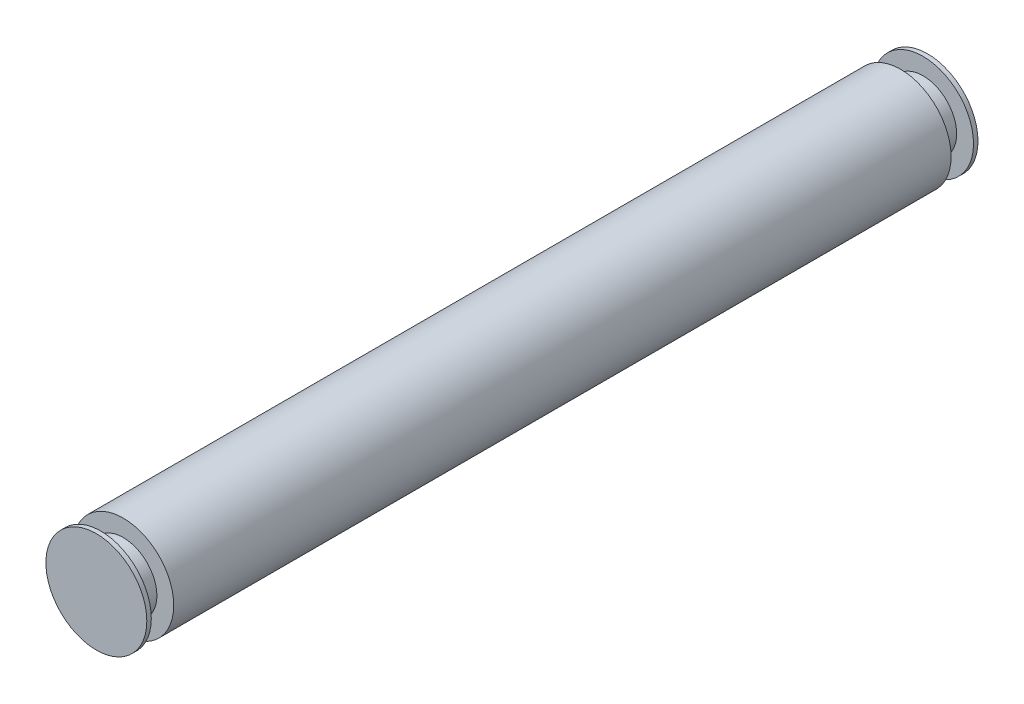
ISO-10303-21;
HEADER;
FILE_DESCRIPTION(('STEP AP214'),'2;1');
FILE_NAME('part.step','',(''),(''),'','','');
FILE_SCHEMA(('AUTOMOTIVE_DESIGN { 1 0 10303 214 1 1 1 1 }'));
ENDSEC;
DATA;
#1=APPLICATION_CONTEXT('core data for automotive mechanical design processes');
#2=APPLICATION_PROTOCOL_DEFINITION('international standard','automotive_design',2000,#1);
#3=PRODUCT_CONTEXT('',#1,'mechanical');
#4=PRODUCT('Part','Part','',(#3));
#5=PRODUCT_RELATED_PRODUCT_CATEGORY('part','',(#4));
#6=PRODUCT_DEFINITION_FORMATION('','',#4);
#7=PRODUCT_DEFINITION_CONTEXT('part definition',#1,'design');
#8=PRODUCT_DEFINITION('design','',#6,#7);
#9=PRODUCT_DEFINITION_SHAPE('','',#8);
#10=(LENGTH_UNIT() NAMED_UNIT(*) SI_UNIT(.MILLI.,.METRE.));
#11=(NAMED_UNIT(*) PLANE_ANGLE_UNIT() SI_UNIT($,.RADIAN.));
#12=(NAMED_UNIT(*) SI_UNIT($,.STERADIAN.) SOLID_ANGLE_UNIT());
#13=UNCERTAINTY_MEASURE_WITH_UNIT(LENGTH_MEASURE(1.E-05),#10,'distance_accuracy_value','');
#14=(GEOMETRIC_REPRESENTATION_CONTEXT(3) GLOBAL_UNCERTAINTY_ASSIGNED_CONTEXT((#13)) GLOBAL_UNIT_ASSIGNED_CONTEXT((#10,
#11,#12)) REPRESENTATION_CONTEXT('',''));
#15=CARTESIAN_POINT('',(0.,0.,0.));
#16=DIRECTION('',(0.,0.,1.));
#17=DIRECTION('',(1.,0.,0.));
#18=AXIS2_PLACEMENT_3D('',#15,#16,#17);
#19=CARTESIAN_POINT('',(0.,0.,173.335));
#20=DIRECTION('',(0.,0.,-1.));
#21=DIRECTION('',(-1.,0.,0.));
#22=AXIS2_PLACEMENT_3D('',#19,#20,#21);
#23=CYLINDRICAL_SURFACE('',#22,22.5);
#24=CARTESIAN_POINT('',(0.,0.,173.335));
#25=DIRECTION('',(0.,0.,1.));
#26=DIRECTION('',(1.,0.,0.));
#27=AXIS2_PLACEMENT_3D('',#24,#25,#26);
#28=CIRCLE('',#27,22.5);
#29=CARTESIAN_POINT('',(22.5,0.,173.335));
#30=VERTEX_POINT('',#29);
#31=EDGE_CURVE('E40',#30,#30,#28,.T.);
#32=ORIENTED_EDGE('',*,*,#31,.F.);
#33=EDGE_LOOP('',(#32));
#34=FACE_BOUND('',#33,.T.);
#35=CARTESIAN_POINT('',(0.,0.,-173.335));
#36=DIRECTION('',(0.,0.,1.));
#37=DIRECTION('',(1.,0.,0.));
#38=AXIS2_PLACEMENT_3D('',#35,#36,#37);
#39=CIRCLE('',#38,22.5);
#40=CARTESIAN_POINT('',(22.5,0.,-173.335));
#41=VERTEX_POINT('',#40);
#42=EDGE_CURVE('E36',#41,#41,#39,.T.);
#43=ORIENTED_EDGE('',*,*,#42,.T.);
#44=EDGE_LOOP('',(#43));
#45=FACE_BOUND('',#44,.T.);
#46=ADVANCED_FACE('F33',(#34,#45),#23,.T.);
#47=CARTESIAN_POINT('',(0.,0.,173.335));
#48=DIRECTION('',(0.,0.,1.));
#49=DIRECTION('',(1.,0.,0.));
#50=AXIS2_PLACEMENT_3D('',#47,#48,#49);
#51=PLANE('',#50);
#52=CARTESIAN_POINT('',(0.,0.,173.335));
#53=DIRECTION('',(0.,0.,1.));
#54=DIRECTION('',(1.,0.,0.));
#55=AXIS2_PLACEMENT_3D('',#52,#53,#54);
#56=CIRCLE('',#55,15.);
#57=CARTESIAN_POINT('',(15.,0.,173.335));
#58=VERTEX_POINT('',#57);
#59=EDGE_CURVE('E10',#58,#58,#56,.T.);
#60=ORIENTED_EDGE('',*,*,#59,.F.);
#61=EDGE_LOOP('',(#60));
#62=FACE_BOUND('',#61,.T.);
#63=ORIENTED_EDGE('',*,*,#31,.T.);
#64=EDGE_LOOP('',(#63));
#65=FACE_BOUND('',#64,.T.);
#66=ADVANCED_FACE('F84',(#62,#65),#51,.T.);
#67=CARTESIAN_POINT('',(0.,0.,-173.335));
#68=DIRECTION('',(0.,0.,1.));
#69=DIRECTION('',(1.,0.,0.));
#70=AXIS2_PLACEMENT_3D('',#67,#68,#69);
#71=PLANE('',#70);
#72=CARTESIAN_POINT('',(0.,0.,-173.335));
#73=DIRECTION('',(0.,0.,1.));
#74=DIRECTION('',(1.,0.,0.));
#75=AXIS2_PLACEMENT_3D('',#72,#73,#74);
#76=CIRCLE('',#75,15.);
#77=CARTESIAN_POINT('',(15.,0.,-173.335));
#78=VERTEX_POINT('',#77);
#79=EDGE_CURVE('E53',#78,#78,#76,.T.);
#80=ORIENTED_EDGE('',*,*,#79,.T.);
#81=EDGE_LOOP('',(#80));
#82=FACE_BOUND('',#81,.T.);
#83=ORIENTED_EDGE('',*,*,#42,.F.);
#84=EDGE_LOOP('',(#83));
#85=FACE_BOUND('',#84,.T.);
#86=ADVANCED_FACE('F89',(#82,#85),#71,.F.);
#87=CARTESIAN_POINT('',(0.,0.,183.335));
#88=DIRECTION('',(0.,0.,-1.));
#89=DIRECTION('',(-1.,0.,0.));
#90=AXIS2_PLACEMENT_3D('',#87,#88,#89);
#91=CYLINDRICAL_SURFACE('',#90,15.);
#92=CARTESIAN_POINT('',(0.,0.,183.335));
#93=DIRECTION('',(0.,0.,1.));
#94=DIRECTION('',(1.,0.,0.));
#95=AXIS2_PLACEMENT_3D('',#92,#93,#94);
#96=CIRCLE('',#95,15.);
#97=CARTESIAN_POINT('',(15.,0.,183.335));
#98=VERTEX_POINT('',#97);
#99=EDGE_CURVE('E46',#98,#98,#96,.T.);
#100=ORIENTED_EDGE('',*,*,#99,.F.);
#101=EDGE_LOOP('',(#100));
#102=FACE_BOUND('',#101,.T.);
#103=ORIENTED_EDGE('',*,*,#59,.T.);
#104=EDGE_LOOP('',(#103));
#105=FACE_BOUND('',#104,.T.);
#106=ADVANCED_FACE('F98',(#102,#105),#91,.T.);
#107=CARTESIAN_POINT('',(0.,0.,185.335));
#108=DIRECTION('',(0.,0.,-1.));
#109=DIRECTION('',(-1.,0.,0.));
#110=AXIS2_PLACEMENT_3D('',#107,#108,#109);
#111=CYLINDRICAL_SURFACE('',#110,22.5);
#112=CARTESIAN_POINT('',(0.,0.,185.335));
#113=DIRECTION('',(0.,0.,1.));
#114=DIRECTION('',(1.,0.,0.));
#115=AXIS2_PLACEMENT_3D('',#112,#113,#114);
#116=CIRCLE('',#115,22.5);
#117=CARTESIAN_POINT('',(22.5,0.,185.335));
#118=VERTEX_POINT('',#117);
#119=EDGE_CURVE('E49',#118,#118,#116,.T.);
#120=ORIENTED_EDGE('',*,*,#119,.F.);
#121=EDGE_LOOP('',(#120));
#122=FACE_BOUND('',#121,.T.);
#123=CARTESIAN_POINT('',(0.,0.,183.335));
#124=DIRECTION('',(0.,0.,1.));
#125=DIRECTION('',(1.,0.,0.));
#126=AXIS2_PLACEMENT_3D('',#123,#124,#125);
#127=CIRCLE('',#126,22.5);
#128=CARTESIAN_POINT('',(22.5,0.,183.335));
#129=VERTEX_POINT('',#128);
#130=EDGE_CURVE('E50',#129,#129,#127,.T.);
#131=ORIENTED_EDGE('',*,*,#130,.T.);
#132=EDGE_LOOP('',(#131));
#133=FACE_BOUND('',#132,.T.);
#134=ADVANCED_FACE('F103',(#122,#133),#111,.T.);
#135=CARTESIAN_POINT('',(0.,0.,185.335));
#136=DIRECTION('',(0.,0.,1.));
#137=DIRECTION('',(1.,0.,0.));
#138=AXIS2_PLACEMENT_3D('',#135,#136,#137);
#139=PLANE('',#138);
#140=ORIENTED_EDGE('',*,*,#119,.T.);
#141=EDGE_LOOP('',(#140));
#142=FACE_BOUND('',#141,.T.);
#143=ADVANCED_FACE('F109',(#142),#139,.T.);
#144=CARTESIAN_POINT('',(0.,0.,183.335));
#145=DIRECTION('',(0.,0.,1.));
#146=DIRECTION('',(1.,0.,0.));
#147=AXIS2_PLACEMENT_3D('',#144,#145,#146);
#148=PLANE('',#147);
#149=ORIENTED_EDGE('',*,*,#99,.T.);
#150=EDGE_LOOP('',(#149));
#151=FACE_BOUND('',#150,.T.);
#152=ORIENTED_EDGE('',*,*,#130,.F.);
#153=EDGE_LOOP('',(#152));
#154=FACE_BOUND('',#153,.T.);
#155=ADVANCED_FACE('F111',(#151,#154),#148,.F.);
#156=CARTESIAN_POINT('',(0.,0.,-183.335));
#157=DIRECTION('',(0.,0.,1.));
#158=DIRECTION('',(1.,0.,0.));
#159=AXIS2_PLACEMENT_3D('',#156,#157,#158);
#160=CYLINDRICAL_SURFACE('',#159,15.);
#161=CARTESIAN_POINT('',(0.,0.,-183.335));
#162=DIRECTION('',(0.,0.,1.));
#163=DIRECTION('',(1.,0.,0.));
#164=AXIS2_PLACEMENT_3D('',#161,#162,#163);
#165=CIRCLE('',#164,15.);
#166=CARTESIAN_POINT('',(15.,0.,-183.335));
#167=VERTEX_POINT('',#166);
#168=EDGE_CURVE('E58',#167,#167,#165,.T.);
#169=ORIENTED_EDGE('',*,*,#168,.T.);
#170=EDGE_LOOP('',(#169));
#171=FACE_BOUND('',#170,.T.);
#172=ORIENTED_EDGE('',*,*,#79,.F.);
#173=EDGE_LOOP('',(#172));
#174=FACE_BOUND('',#173,.T.);
#175=ADVANCED_FACE('F81',(#171,#174),#160,.T.);
#176=CARTESIAN_POINT('',(0.,0.,-185.335));
#177=DIRECTION('',(0.,0.,1.));
#178=DIRECTION('',(1.,0.,0.));
#179=AXIS2_PLACEMENT_3D('',#176,#177,#178);
#180=CYLINDRICAL_SURFACE('',#179,22.5);
#181=CARTESIAN_POINT('',(0.,0.,-185.335));
#182=DIRECTION('',(0.,0.,1.));
#183=DIRECTION('',(1.,0.,0.));
#184=AXIS2_PLACEMENT_3D('',#181,#182,#183);
#185=CIRCLE('',#184,22.5);
#186=CARTESIAN_POINT('',(22.5,0.,-185.335));
#187=VERTEX_POINT('',#186);
#188=EDGE_CURVE('E61',#187,#187,#185,.T.);
#189=ORIENTED_EDGE('',*,*,#188,.T.);
#190=EDGE_LOOP('',(#189));
#191=FACE_BOUND('',#190,.T.);
#192=CARTESIAN_POINT('',(0.,0.,-183.335));
#193=DIRECTION('',(0.,0.,1.));
#194=DIRECTION('',(1.,0.,0.));
#195=AXIS2_PLACEMENT_3D('',#192,#193,#194);
#196=CIRCLE('',#195,22.5);
#197=CARTESIAN_POINT('',(22.5,0.,-183.335));
#198=VERTEX_POINT('',#197);
#199=EDGE_CURVE('E62',#198,#198,#196,.T.);
#200=ORIENTED_EDGE('',*,*,#199,.F.);
#201=EDGE_LOOP('',(#200));
#202=FACE_BOUND('',#201,.T.);
#203=ADVANCED_FACE('F68',(#191,#202),#180,.T.);
#204=CARTESIAN_POINT('',(0.,0.,-185.335));
#205=DIRECTION('',(0.,0.,-1.));
#206=DIRECTION('',(1.,0.,0.));
#207=AXIS2_PLACEMENT_3D('',#204,#205,#206);
#208=PLANE('',#207);
#209=ORIENTED_EDGE('',*,*,#188,.F.);
#210=EDGE_LOOP('',(#209));
#211=FACE_BOUND('',#210,.T.);
#212=ADVANCED_FACE('F71',(#211),#208,.T.);
#213=CARTESIAN_POINT('',(0.,0.,-183.335));
#214=DIRECTION('',(0.,0.,-1.));
#215=DIRECTION('',(1.,0.,0.));
#216=AXIS2_PLACEMENT_3D('',#213,#214,#215);
#217=PLANE('',#216);
#218=ORIENTED_EDGE('',*,*,#168,.F.);
#219=EDGE_LOOP('',(#218));
#220=FACE_BOUND('',#219,.T.);
#221=ORIENTED_EDGE('',*,*,#199,.T.);
#222=EDGE_LOOP('',(#221));
#223=FACE_BOUND('',#222,.T.);
#224=ADVANCED_FACE('F73',(#220,#223),#217,.F.);
#225=CLOSED_SHELL('',(#46,#66,#86,#106,#134,#143,#155,#175,#203,#212,#224));
#226=MANIFOLD_SOLID_BREP('B2',#225);
#227=ADVANCED_BREP_SHAPE_REPRESENTATION('',(#18,#226),#14);
#228=SHAPE_DEFINITION_REPRESENTATION(#9,#227);
ENDSEC;
END-ISO-10303-21;
